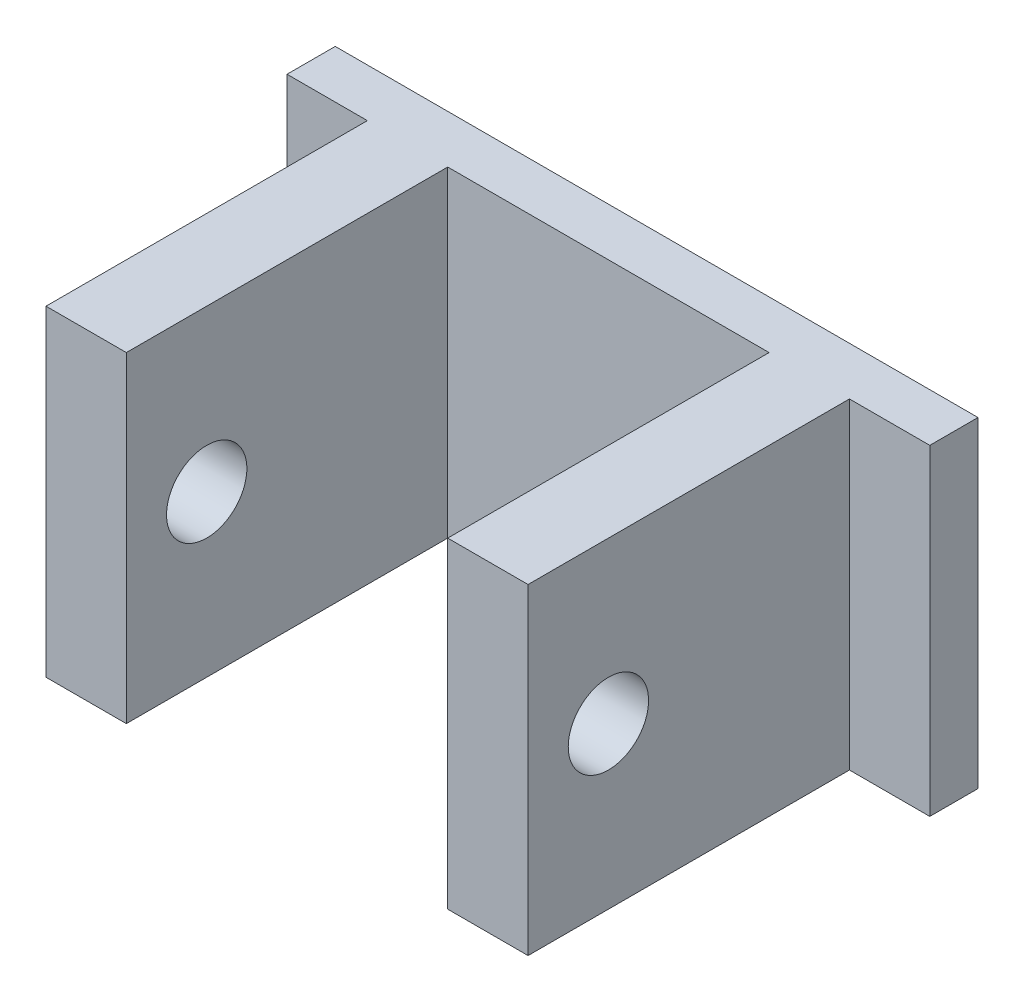
ISO-10303-21;
HEADER;
FILE_DESCRIPTION(('STEP AP214'),'2;1');
FILE_NAME('part.step','',(''),(''),'','','');
FILE_SCHEMA(('AUTOMOTIVE_DESIGN { 1 0 10303 214 1 1 1 1 }'));
ENDSEC;
DATA;
#1=APPLICATION_CONTEXT('core data for automotive mechanical design processes');
#2=APPLICATION_PROTOCOL_DEFINITION('international standard','automotive_design',2000,#1);
#3=PRODUCT_CONTEXT('',#1,'mechanical');
#4=PRODUCT('Part','Part','',(#3));
#5=PRODUCT_RELATED_PRODUCT_CATEGORY('part','',(#4));
#6=PRODUCT_DEFINITION_FORMATION('','',#4);
#7=PRODUCT_DEFINITION_CONTEXT('part definition',#1,'design');
#8=PRODUCT_DEFINITION('design','',#6,#7);
#9=PRODUCT_DEFINITION_SHAPE('','',#8);
#10=(LENGTH_UNIT() NAMED_UNIT(*) SI_UNIT(.MILLI.,.METRE.));
#11=(NAMED_UNIT(*) PLANE_ANGLE_UNIT() SI_UNIT($,.RADIAN.));
#12=(NAMED_UNIT(*) SI_UNIT($,.STERADIAN.) SOLID_ANGLE_UNIT());
#13=UNCERTAINTY_MEASURE_WITH_UNIT(LENGTH_MEASURE(1.E-05),#10,'distance_accuracy_value','');
#14=(GEOMETRIC_REPRESENTATION_CONTEXT(3) GLOBAL_UNCERTAINTY_ASSIGNED_CONTEXT((#13)) GLOBAL_UNIT_ASSIGNED_CONTEXT((#10,
#11,#12)) REPRESENTATION_CONTEXT('',''));
#15=CARTESIAN_POINT('',(0.,0.,0.));
#16=DIRECTION('',(0.,0.,1.));
#17=DIRECTION('',(1.,0.,0.));
#18=AXIS2_PLACEMENT_3D('',#15,#16,#17);
#19=CARTESIAN_POINT('',(-12.7,-12.7,-1.59488729854373));
#20=DIRECTION('',(1.,0.,0.));
#21=DIRECTION('',(0.,0.,-1.));
#22=AXIS2_PLACEMENT_3D('',#19,#20,#21);
#23=PLANE('',#22);
#24=DIRECTION('',(0.,0.,-1.));
#25=VECTOR('',#24,1.);
#26=CARTESIAN_POINT('',(-12.7,12.7,-1.59488729854373));
#27=LINE('',#26,#25);
#28=CARTESIAN_POINT('',(-12.7,12.7,0.310112701456273));
#29=VERTEX_POINT('',#28);
#30=CARTESIAN_POINT('',(-12.7,12.7,-3.49988729854373));
#31=VERTEX_POINT('',#30);
#32=EDGE_CURVE('E137',#29,#31,#27,.T.);
#33=ORIENTED_EDGE('',*,*,#32,.T.);
#34=DIRECTION('',(0.,1.,0.));
#35=VECTOR('',#34,1.);
#36=CARTESIAN_POINT('',(-12.7,-12.7,-3.49988729854373));
#37=LINE('',#36,#35);
#38=CARTESIAN_POINT('',(-12.7,-12.7,-3.49988729854373));
#39=VERTEX_POINT('',#38);
#40=EDGE_CURVE('E11',#39,#31,#37,.T.);
#41=ORIENTED_EDGE('',*,*,#40,.F.);
#42=DIRECTION('',(0.,0.,-1.));
#43=VECTOR('',#42,1.);
#44=CARTESIAN_POINT('',(-12.7,-12.7,-1.59488729854373));
#45=LINE('',#44,#43);
#46=CARTESIAN_POINT('',(-12.7,-12.7,0.310112701456273));
#47=VERTEX_POINT('',#46);
#48=EDGE_CURVE('E160',#47,#39,#45,.T.);
#49=ORIENTED_EDGE('',*,*,#48,.F.);
#50=DIRECTION('',(0.,1.,0.));
#51=VECTOR('',#50,1.);
#52=CARTESIAN_POINT('',(-12.7,-12.7,0.310112701456273));
#53=LINE('',#52,#51);
#54=EDGE_CURVE('E133',#47,#29,#53,.T.);
#55=ORIENTED_EDGE('',*,*,#54,.T.);
#56=EDGE_LOOP('',(#33,#41,#49,#55));
#57=FACE_BOUND('',#56,.T.);
#58=ADVANCED_FACE('F17',(#57),#23,.F.);
#59=CARTESIAN_POINT('',(12.7,-12.7,-3.49988729854373));
#60=DIRECTION('',(0.,0.,1.));
#61=DIRECTION('',(1.,0.,0.));
#62=AXIS2_PLACEMENT_3D('',#59,#60,#61);
#63=PLANE('',#62);
#64=DIRECTION('',(1.,0.,0.));
#65=VECTOR('',#64,1.);
#66=CARTESIAN_POINT('',(12.7,12.7,-3.49988729854373));
#67=LINE('',#66,#65);
#68=CARTESIAN_POINT('',(38.1,12.7,-3.49988729854373));
#69=VERTEX_POINT('',#68);
#70=EDGE_CURVE('E140',#31,#69,#67,.T.);
#71=ORIENTED_EDGE('',*,*,#70,.T.);
#72=DIRECTION('',(0.,1.,0.));
#73=VECTOR('',#72,1.);
#74=CARTESIAN_POINT('',(38.1,-12.7,-3.49988729854373));
#75=LINE('',#74,#73);
#76=CARTESIAN_POINT('',(38.1,-12.7,-3.49988729854373));
#77=VERTEX_POINT('',#76);
#78=EDGE_CURVE('E25',#77,#69,#75,.T.);
#79=ORIENTED_EDGE('',*,*,#78,.F.);
#80=DIRECTION('',(1.,0.,0.));
#81=VECTOR('',#80,1.);
#82=CARTESIAN_POINT('',(12.7,-12.7,-3.49988729854373));
#83=LINE('',#82,#81);
#84=EDGE_CURVE('E88',#39,#77,#83,.T.);
#85=ORIENTED_EDGE('',*,*,#84,.F.);
#86=ORIENTED_EDGE('',*,*,#40,.T.);
#87=EDGE_LOOP('',(#71,#79,#85,#86));
#88=FACE_BOUND('',#87,.T.);
#89=ADVANCED_FACE('F240',(#88),#63,.F.);
#90=CARTESIAN_POINT('',(38.1,-12.7,-1.59488729854373));
#91=DIRECTION('',(-1.,0.,0.));
#92=DIRECTION('',(0.,0.,1.));
#93=AXIS2_PLACEMENT_3D('',#90,#91,#92);
#94=PLANE('',#93);
#95=DIRECTION('',(0.,0.,1.));
#96=VECTOR('',#95,1.);
#97=CARTESIAN_POINT('',(38.1,12.7,-1.59488729854373));
#98=LINE('',#97,#96);
#99=CARTESIAN_POINT('',(38.1,12.7,0.310112701456274));
#100=VERTEX_POINT('',#99);
#101=EDGE_CURVE('E143',#69,#100,#98,.T.);
#102=ORIENTED_EDGE('',*,*,#101,.T.);
#103=DIRECTION('',(0.,1.,0.));
#104=VECTOR('',#103,1.);
#105=CARTESIAN_POINT('',(38.1,-12.7,0.310112701456274));
#106=LINE('',#105,#104);
#107=CARTESIAN_POINT('',(38.1,-12.7,0.310112701456274));
#108=VERTEX_POINT('',#107);
#109=EDGE_CURVE('E179',#108,#100,#106,.T.);
#110=ORIENTED_EDGE('',*,*,#109,.F.);
#111=DIRECTION('',(0.,0.,1.));
#112=VECTOR('',#111,1.);
#113=CARTESIAN_POINT('',(38.1,-12.7,-1.59488729854373));
#114=LINE('',#113,#112);
#115=EDGE_CURVE('E187',#77,#108,#114,.T.);
#116=ORIENTED_EDGE('',*,*,#115,.F.);
#117=ORIENTED_EDGE('',*,*,#78,.T.);
#118=EDGE_LOOP('',(#102,#110,#116,#117));
#119=FACE_BOUND('',#118,.T.);
#120=ADVANCED_FACE('F185',(#119),#94,.F.);
#121=CARTESIAN_POINT('',(34.925,-12.7,0.310112701456273));
#122=DIRECTION('',(0.,0.,-1.));
#123=DIRECTION('',(-1.,0.,0.));
#124=AXIS2_PLACEMENT_3D('',#121,#122,#123);
#125=PLANE('',#124);
#126=DIRECTION('',(-1.,0.,0.));
#127=VECTOR('',#126,1.);
#128=CARTESIAN_POINT('',(34.925,12.7,0.310112701456273));
#129=LINE('',#128,#127);
#130=CARTESIAN_POINT('',(31.75,12.7,0.310112701456274));
#131=VERTEX_POINT('',#130);
#132=EDGE_CURVE('E145',#100,#131,#129,.T.);
#133=ORIENTED_EDGE('',*,*,#132,.T.);
#134=DIRECTION('',(0.,1.,0.));
#135=VECTOR('',#134,1.);
#136=CARTESIAN_POINT('',(31.75,-12.7,0.310112701456274));
#137=LINE('',#136,#135);
#138=CARTESIAN_POINT('',(31.75,-12.7,0.310112701456274));
#139=VERTEX_POINT('',#138);
#140=EDGE_CURVE('E176',#139,#131,#137,.T.);
#141=ORIENTED_EDGE('',*,*,#140,.F.);
#142=DIRECTION('',(-1.,0.,0.));
#143=VECTOR('',#142,1.);
#144=CARTESIAN_POINT('',(34.925,-12.7,0.310112701456273));
#145=LINE('',#144,#143);
#146=EDGE_CURVE('E205',#108,#139,#145,.T.);
#147=ORIENTED_EDGE('',*,*,#146,.F.);
#148=ORIENTED_EDGE('',*,*,#109,.T.);
#149=EDGE_LOOP('',(#133,#141,#147,#148));
#150=FACE_BOUND('',#149,.T.);
#151=ADVANCED_FACE('F196',(#150),#125,.F.);
#152=CARTESIAN_POINT('',(31.75,-12.7,13.0101127014563));
#153=DIRECTION('',(-1.,0.,0.));
#154=DIRECTION('',(0.,0.,1.));
#155=AXIS2_PLACEMENT_3D('',#152,#153,#154);
#156=PLANE('',#155);
#157=CARTESIAN_POINT('',(31.75,0.,19.3601127014562));
#158=DIRECTION('',(-1.,0.,0.));
#159=DIRECTION('',(0.,0.,1.));
#160=AXIS2_PLACEMENT_3D('',#157,#158,#159);
#161=CIRCLE('',#160,3.175);
#162=CARTESIAN_POINT('',(31.75,0.,22.5351127014562));
#163=VERTEX_POINT('',#162);
#164=EDGE_CURVE('E141',#163,#163,#161,.T.);
#165=ORIENTED_EDGE('',*,*,#164,.T.);
#166=EDGE_LOOP('',(#165));
#167=FACE_BOUND('',#166,.T.);
#168=DIRECTION('',(0.,0.,1.));
#169=VECTOR('',#168,1.);
#170=CARTESIAN_POINT('',(31.75,12.7,13.0101127014563));
#171=LINE('',#170,#169);
#172=CARTESIAN_POINT('',(31.75,12.7,25.7101127014563));
#173=VERTEX_POINT('',#172);
#174=EDGE_CURVE('E147',#131,#173,#171,.T.);
#175=ORIENTED_EDGE('',*,*,#174,.T.);
#176=DIRECTION('',(0.,1.,0.));
#177=VECTOR('',#176,1.);
#178=CARTESIAN_POINT('',(31.75,-12.7,25.7101127014563));
#179=LINE('',#178,#177);
#180=CARTESIAN_POINT('',(31.75,-12.7,25.7101127014563));
#181=VERTEX_POINT('',#180);
#182=EDGE_CURVE('E173',#181,#173,#179,.T.);
#183=ORIENTED_EDGE('',*,*,#182,.F.);
#184=DIRECTION('',(0.,0.,1.));
#185=VECTOR('',#184,1.);
#186=CARTESIAN_POINT('',(31.75,-12.7,13.0101127014563));
#187=LINE('',#186,#185);
#188=EDGE_CURVE('E202',#139,#181,#187,.T.);
#189=ORIENTED_EDGE('',*,*,#188,.F.);
#190=ORIENTED_EDGE('',*,*,#140,.T.);
#191=EDGE_LOOP('',(#175,#183,#189,#190));
#192=FACE_BOUND('',#191,.T.);
#193=ADVANCED_FACE('F200',(#167,#192),#156,.F.);
#194=CARTESIAN_POINT('',(28.575,-12.7,25.7101127014563));
#195=DIRECTION('',(0.,0.,-1.));
#196=DIRECTION('',(-1.,0.,0.));
#197=AXIS2_PLACEMENT_3D('',#194,#195,#196);
#198=PLANE('',#197);
#199=DIRECTION('',(-1.,0.,0.));
#200=VECTOR('',#199,1.);
#201=CARTESIAN_POINT('',(28.575,12.7,25.7101127014563));
#202=LINE('',#201,#200);
#203=CARTESIAN_POINT('',(25.4,12.7,25.7101127014563));
#204=VERTEX_POINT('',#203);
#205=EDGE_CURVE('E149',#173,#204,#202,.T.);
#206=ORIENTED_EDGE('',*,*,#205,.T.);
#207=DIRECTION('',(0.,1.,0.));
#208=VECTOR('',#207,1.);
#209=CARTESIAN_POINT('',(25.4,-12.7,25.7101127014563));
#210=LINE('',#209,#208);
#211=CARTESIAN_POINT('',(25.4,-12.7,25.7101127014563));
#212=VERTEX_POINT('',#211);
#213=EDGE_CURVE('E170',#212,#204,#210,.T.);
#214=ORIENTED_EDGE('',*,*,#213,.F.);
#215=DIRECTION('',(-1.,0.,0.));
#216=VECTOR('',#215,1.);
#217=CARTESIAN_POINT('',(28.575,-12.7,25.7101127014563));
#218=LINE('',#217,#216);
#219=EDGE_CURVE('E204',#181,#212,#218,.T.);
#220=ORIENTED_EDGE('',*,*,#219,.F.);
#221=ORIENTED_EDGE('',*,*,#182,.T.);
#222=EDGE_LOOP('',(#206,#214,#220,#221));
#223=FACE_BOUND('',#222,.T.);
#224=ADVANCED_FACE('F253',(#223),#198,.F.);
#225=CARTESIAN_POINT('',(25.4,-12.7,13.0101127014563));
#226=DIRECTION('',(1.,0.,0.));
#227=DIRECTION('',(0.,0.,-1.));
#228=AXIS2_PLACEMENT_3D('',#225,#226,#227);
#229=PLANE('',#228);
#230=CARTESIAN_POINT('',(25.4,0.,19.3601127014562));
#231=DIRECTION('',(1.,0.,0.));
#232=DIRECTION('',(0.,0.,-1.));
#233=AXIS2_PLACEMENT_3D('',#230,#231,#232);
#234=CIRCLE('',#233,3.175);
#235=CARTESIAN_POINT('',(25.4,0.,16.1851127014562));
#236=VERTEX_POINT('',#235);
#237=EDGE_CURVE('E326',#236,#236,#234,.T.);
#238=ORIENTED_EDGE('',*,*,#237,.T.);
#239=EDGE_LOOP('',(#238));
#240=FACE_BOUND('',#239,.T.);
#241=DIRECTION('',(0.,0.,-1.));
#242=VECTOR('',#241,1.);
#243=CARTESIAN_POINT('',(25.4,12.7,13.0101127014563));
#244=LINE('',#243,#242);
#245=CARTESIAN_POINT('',(25.4,12.7,0.310112701456266));
#246=VERTEX_POINT('',#245);
#247=EDGE_CURVE('E151',#204,#246,#244,.T.);
#248=ORIENTED_EDGE('',*,*,#247,.T.);
#249=DIRECTION('',(0.,1.,0.));
#250=VECTOR('',#249,1.);
#251=CARTESIAN_POINT('',(25.4,-12.7,0.310112701456266));
#252=LINE('',#251,#250);
#253=CARTESIAN_POINT('',(25.4,-12.7,0.310112701456266));
#254=VERTEX_POINT('',#253);
#255=EDGE_CURVE('E167',#254,#246,#252,.T.);
#256=ORIENTED_EDGE('',*,*,#255,.F.);
#257=DIRECTION('',(0.,0.,-1.));
#258=VECTOR('',#257,1.);
#259=CARTESIAN_POINT('',(25.4,-12.7,13.0101127014563));
#260=LINE('',#259,#258);
#261=EDGE_CURVE('E207',#212,#254,#260,.T.);
#262=ORIENTED_EDGE('',*,*,#261,.F.);
#263=ORIENTED_EDGE('',*,*,#213,.T.);
#264=EDGE_LOOP('',(#248,#256,#262,#263));
#265=FACE_BOUND('',#264,.T.);
#266=ADVANCED_FACE('F257',(#240,#265),#229,.F.);
#267=CARTESIAN_POINT('',(12.7,-12.7,0.310112701456266));
#268=DIRECTION('',(0.,0.,-1.));
#269=DIRECTION('',(-1.,0.,0.));
#270=AXIS2_PLACEMENT_3D('',#267,#268,#269);
#271=PLANE('',#270);
#272=DIRECTION('',(-1.,0.,0.));
#273=VECTOR('',#272,1.);
#274=CARTESIAN_POINT('',(12.7,12.7,0.310112701456266));
#275=LINE('',#274,#273);
#276=CARTESIAN_POINT('',(0.,12.7,0.310112701456264));
#277=VERTEX_POINT('',#276);
#278=EDGE_CURVE('E153',#246,#277,#275,.T.);
#279=ORIENTED_EDGE('',*,*,#278,.T.);
#280=DIRECTION('',(0.,1.,0.));
#281=VECTOR('',#280,1.);
#282=CARTESIAN_POINT('',(0.,-12.7,0.310112701456264));
#283=LINE('',#282,#281);
#284=CARTESIAN_POINT('',(0.,-12.7,0.310112701456264));
#285=VERTEX_POINT('',#284);
#286=EDGE_CURVE('E164',#285,#277,#283,.T.);
#287=ORIENTED_EDGE('',*,*,#286,.F.);
#288=DIRECTION('',(-1.,0.,0.));
#289=VECTOR('',#288,1.);
#290=CARTESIAN_POINT('',(12.7,-12.7,0.310112701456266));
#291=LINE('',#290,#289);
#292=EDGE_CURVE('E213',#254,#285,#291,.T.);
#293=ORIENTED_EDGE('',*,*,#292,.F.);
#294=ORIENTED_EDGE('',*,*,#255,.T.);
#295=EDGE_LOOP('',(#279,#287,#293,#294));
#296=FACE_BOUND('',#295,.T.);
#297=ADVANCED_FACE('F219',(#296),#271,.F.);
#298=CARTESIAN_POINT('',(0.,-12.7,13.0101127014563));
#299=DIRECTION('',(-1.,0.,0.));
#300=DIRECTION('',(0.,0.,1.));
#301=AXIS2_PLACEMENT_3D('',#298,#299,#300);
#302=PLANE('',#301);
#303=CARTESIAN_POINT('',(0.,0.,19.3601127014562));
#304=DIRECTION('',(-1.,0.,0.));
#305=DIRECTION('',(0.,0.,1.));
#306=AXIS2_PLACEMENT_3D('',#303,#304,#305);
#307=CIRCLE('',#306,3.175);
#308=CARTESIAN_POINT('',(0.,0.,22.5351127014562));
#309=VERTEX_POINT('',#308);
#310=EDGE_CURVE('E330',#309,#309,#307,.T.);
#311=ORIENTED_EDGE('',*,*,#310,.T.);
#312=EDGE_LOOP('',(#311));
#313=FACE_BOUND('',#312,.T.);
#314=DIRECTION('',(0.,0.,1.));
#315=VECTOR('',#314,1.);
#316=CARTESIAN_POINT('',(0.,12.7,13.0101127014563));
#317=LINE('',#316,#315);
#318=CARTESIAN_POINT('',(0.,12.7,25.7101127014562));
#319=VERTEX_POINT('',#318);
#320=EDGE_CURVE('E155',#277,#319,#317,.T.);
#321=ORIENTED_EDGE('',*,*,#320,.T.);
#322=DIRECTION('',(0.,1.,0.));
#323=VECTOR('',#322,1.);
#324=CARTESIAN_POINT('',(0.,-12.7,25.7101127014562));
#325=LINE('',#324,#323);
#326=CARTESIAN_POINT('',(0.,-12.7,25.7101127014562));
#327=VERTEX_POINT('',#326);
#328=EDGE_CURVE('E128',#327,#319,#325,.T.);
#329=ORIENTED_EDGE('',*,*,#328,.F.);
#330=DIRECTION('',(0.,0.,1.));
#331=VECTOR('',#330,1.);
#332=CARTESIAN_POINT('',(0.,-12.7,13.0101127014563));
#333=LINE('',#332,#331);
#334=EDGE_CURVE('E119',#285,#327,#333,.T.);
#335=ORIENTED_EDGE('',*,*,#334,.F.);
#336=ORIENTED_EDGE('',*,*,#286,.T.);
#337=EDGE_LOOP('',(#321,#329,#335,#336));
#338=FACE_BOUND('',#337,.T.);
#339=ADVANCED_FACE('F223',(#313,#338),#302,.F.);
#340=CARTESIAN_POINT('',(-3.175,-12.7,25.7101127014562));
#341=DIRECTION('',(0.,0.,-1.));
#342=DIRECTION('',(-1.,0.,0.));
#343=AXIS2_PLACEMENT_3D('',#340,#341,#342);
#344=PLANE('',#343);
#345=DIRECTION('',(-1.,0.,0.));
#346=VECTOR('',#345,1.);
#347=CARTESIAN_POINT('',(-3.175,12.7,25.7101127014562));
#348=LINE('',#347,#346);
#349=CARTESIAN_POINT('',(-6.35,12.7,25.7101127014562));
#350=VERTEX_POINT('',#349);
#351=EDGE_CURVE('E127',#319,#350,#348,.T.);
#352=ORIENTED_EDGE('',*,*,#351,.T.);
#353=DIRECTION('',(0.,1.,0.));
#354=VECTOR('',#353,1.);
#355=CARTESIAN_POINT('',(-6.35,-12.7,25.7101127014562));
#356=LINE('',#355,#354);
#357=CARTESIAN_POINT('',(-6.35,-12.7,25.7101127014562));
#358=VERTEX_POINT('',#357);
#359=EDGE_CURVE('E124',#358,#350,#356,.T.);
#360=ORIENTED_EDGE('',*,*,#359,.F.);
#361=DIRECTION('',(-1.,0.,0.));
#362=VECTOR('',#361,1.);
#363=CARTESIAN_POINT('',(-3.175,-12.7,25.7101127014562));
#364=LINE('',#363,#362);
#365=EDGE_CURVE('E113',#327,#358,#364,.T.);
#366=ORIENTED_EDGE('',*,*,#365,.F.);
#367=ORIENTED_EDGE('',*,*,#328,.T.);
#368=EDGE_LOOP('',(#352,#360,#366,#367));
#369=FACE_BOUND('',#368,.T.);
#370=ADVANCED_FACE('F125',(#369),#344,.F.);
#371=CARTESIAN_POINT('',(-6.35,-12.7,13.0101127014563));
#372=DIRECTION('',(1.,0.,0.));
#373=DIRECTION('',(0.,0.,-1.));
#374=AXIS2_PLACEMENT_3D('',#371,#372,#373);
#375=PLANE('',#374);
#376=CARTESIAN_POINT('',(-6.35,0.,19.3601127014562));
#377=DIRECTION('',(-1.,0.,0.));
#378=DIRECTION('',(0.,0.,1.));
#379=AXIS2_PLACEMENT_3D('',#376,#377,#378);
#380=CIRCLE('',#379,3.175);
#381=CARTESIAN_POINT('',(-6.35,0.,22.5351127014562));
#382=VERTEX_POINT('',#381);
#383=EDGE_CURVE('E337',#382,#382,#380,.T.);
#384=ORIENTED_EDGE('',*,*,#383,.F.);
#385=EDGE_LOOP('',(#384));
#386=FACE_BOUND('',#385,.T.);
#387=DIRECTION('',(0.,0.,-1.));
#388=VECTOR('',#387,1.);
#389=CARTESIAN_POINT('',(-6.35,12.7,13.0101127014563));
#390=LINE('',#389,#388);
#391=CARTESIAN_POINT('',(-6.35,12.7,0.31011270145627));
#392=VERTEX_POINT('',#391);
#393=EDGE_CURVE('E74',#350,#392,#390,.T.);
#394=ORIENTED_EDGE('',*,*,#393,.T.);
#395=DIRECTION('',(0.,1.,0.));
#396=VECTOR('',#395,1.);
#397=CARTESIAN_POINT('',(-6.35,-12.7,0.31011270145627));
#398=LINE('',#397,#396);
#399=CARTESIAN_POINT('',(-6.35,-12.7,0.31011270145627));
#400=VERTEX_POINT('',#399);
#401=EDGE_CURVE('E129',#400,#392,#398,.T.);
#402=ORIENTED_EDGE('',*,*,#401,.F.);
#403=DIRECTION('',(0.,0.,-1.));
#404=VECTOR('',#403,1.);
#405=CARTESIAN_POINT('',(-6.35,-12.7,13.0101127014563));
#406=LINE('',#405,#404);
#407=EDGE_CURVE('E117',#358,#400,#406,.T.);
#408=ORIENTED_EDGE('',*,*,#407,.F.);
#409=ORIENTED_EDGE('',*,*,#359,.T.);
#410=EDGE_LOOP('',(#394,#402,#408,#409));
#411=FACE_BOUND('',#410,.T.);
#412=ADVANCED_FACE('F131',(#386,#411),#375,.F.);
#413=CARTESIAN_POINT('',(-9.525,-12.7,0.31011270145627));
#414=DIRECTION('',(0.,0.,-1.));
#415=DIRECTION('',(-1.,0.,0.));
#416=AXIS2_PLACEMENT_3D('',#413,#414,#415);
#417=PLANE('',#416);
#418=DIRECTION('',(-1.,0.,0.));
#419=VECTOR('',#418,1.);
#420=CARTESIAN_POINT('',(-9.525,12.7,0.31011270145627));
#421=LINE('',#420,#419);
#422=EDGE_CURVE('E80',#392,#29,#421,.T.);
#423=ORIENTED_EDGE('',*,*,#422,.T.);
#424=ORIENTED_EDGE('',*,*,#54,.F.);
#425=DIRECTION('',(-1.,0.,0.));
#426=VECTOR('',#425,1.);
#427=CARTESIAN_POINT('',(-9.525,-12.7,0.31011270145627));
#428=LINE('',#427,#426);
#429=EDGE_CURVE('E33',#400,#47,#428,.T.);
#430=ORIENTED_EDGE('',*,*,#429,.F.);
#431=ORIENTED_EDGE('',*,*,#401,.T.);
#432=EDGE_LOOP('',(#423,#424,#430,#431));
#433=FACE_BOUND('',#432,.T.);
#434=ADVANCED_FACE('F227',(#433),#417,.F.);
#435=CARTESIAN_POINT('',(12.7,-12.7,11.1051127014563));
#436=DIRECTION('',(0.,-1.,0.));
#437=DIRECTION('',(1.,0.,0.));
#438=AXIS2_PLACEMENT_3D('',#435,#436,#437);
#439=PLANE('',#438);
#440=ORIENTED_EDGE('',*,*,#48,.T.);
#441=ORIENTED_EDGE('',*,*,#84,.T.);
#442=ORIENTED_EDGE('',*,*,#115,.T.);
#443=ORIENTED_EDGE('',*,*,#146,.T.);
#444=ORIENTED_EDGE('',*,*,#188,.T.);
#445=ORIENTED_EDGE('',*,*,#219,.T.);
#446=ORIENTED_EDGE('',*,*,#261,.T.);
#447=ORIENTED_EDGE('',*,*,#292,.T.);
#448=ORIENTED_EDGE('',*,*,#334,.T.);
#449=ORIENTED_EDGE('',*,*,#365,.T.);
#450=ORIENTED_EDGE('',*,*,#407,.T.);
#451=ORIENTED_EDGE('',*,*,#429,.T.);
#452=EDGE_LOOP('',(#440,#441,#442,#443,#444,#445,#446,#447,#448,#449,#450,#451));
#453=FACE_BOUND('',#452,.T.);
#454=ADVANCED_FACE('F115',(#453),#439,.T.);
#455=CARTESIAN_POINT('',(12.7,12.7,11.1051127014563));
#456=DIRECTION('',(0.,-1.,0.));
#457=DIRECTION('',(1.,0.,0.));
#458=AXIS2_PLACEMENT_3D('',#455,#456,#457);
#459=PLANE('',#458);
#460=ORIENTED_EDGE('',*,*,#32,.F.);
#461=ORIENTED_EDGE('',*,*,#422,.F.);
#462=ORIENTED_EDGE('',*,*,#393,.F.);
#463=ORIENTED_EDGE('',*,*,#351,.F.);
#464=ORIENTED_EDGE('',*,*,#320,.F.);
#465=ORIENTED_EDGE('',*,*,#278,.F.);
#466=ORIENTED_EDGE('',*,*,#247,.F.);
#467=ORIENTED_EDGE('',*,*,#205,.F.);
#468=ORIENTED_EDGE('',*,*,#174,.F.);
#469=ORIENTED_EDGE('',*,*,#132,.F.);
#470=ORIENTED_EDGE('',*,*,#101,.F.);
#471=ORIENTED_EDGE('',*,*,#70,.F.);
#472=EDGE_LOOP('',(#460,#461,#462,#463,#464,#465,#466,#467,#468,#469,#470,#471));
#473=FACE_BOUND('',#472,.T.);
#474=ADVANCED_FACE('F191',(#473),#459,.F.);
#475=CARTESIAN_POINT('',(57.5272380802552,0.,19.3601127014563));
#476=DIRECTION('',(-1.,0.,0.));
#477=DIRECTION('',(0.,0.,1.));
#478=AXIS2_PLACEMENT_3D('',#475,#476,#477);
#479=CYLINDRICAL_SURFACE('',#478,3.175);
#480=ORIENTED_EDGE('',*,*,#383,.T.);
#481=EDGE_LOOP('',(#480));
#482=FACE_BOUND('',#481,.T.);
#483=ORIENTED_EDGE('',*,*,#310,.F.);
#484=EDGE_LOOP('',(#483));
#485=FACE_BOUND('',#484,.T.);
#486=ADVANCED_FACE('F300',(#482,#485),#479,.F.);
#487=ORIENTED_EDGE('',*,*,#237,.F.);
#488=EDGE_LOOP('',(#487));
#489=FACE_BOUND('',#488,.T.);
#490=ORIENTED_EDGE('',*,*,#164,.F.);
#491=EDGE_LOOP('',(#490));
#492=FACE_BOUND('',#491,.T.);
#493=ADVANCED_FACE('F308',(#489,#492),#479,.F.);
#494=CLOSED_SHELL('',(#58,#89,#120,#151,#193,#224,#266,#297,#339,#370,#412,#434,#454,#474,#486,#493));
#495=MANIFOLD_SOLID_BREP('B1',#494);
#496=ADVANCED_BREP_SHAPE_REPRESENTATION('',(#18,#495),#14);
#497=SHAPE_DEFINITION_REPRESENTATION(#9,#496);
ENDSEC;
END-ISO-10303-21;
